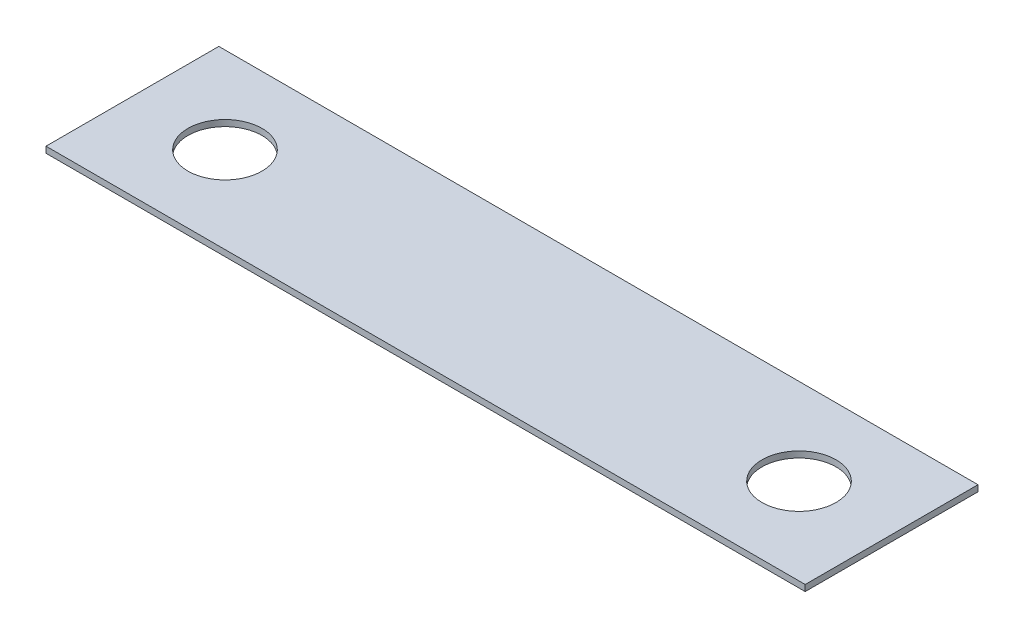
ISO-10303-21;
HEADER;
FILE_DESCRIPTION(('STEP AP214'),'2;1');
FILE_NAME('part.step','',(''),(''),'','','');
FILE_SCHEMA(('AUTOMOTIVE_DESIGN { 1 0 10303 214 1 1 1 1 }'));
ENDSEC;
DATA;
#1=APPLICATION_CONTEXT('core data for automotive mechanical design processes');
#2=APPLICATION_PROTOCOL_DEFINITION('international standard','automotive_design',2000,#1);
#3=PRODUCT_CONTEXT('',#1,'mechanical');
#4=PRODUCT('Part','Part','',(#3));
#5=PRODUCT_RELATED_PRODUCT_CATEGORY('part','',(#4));
#6=PRODUCT_DEFINITION_FORMATION('','',#4);
#7=PRODUCT_DEFINITION_CONTEXT('part definition',#1,'design');
#8=PRODUCT_DEFINITION('design','',#6,#7);
#9=PRODUCT_DEFINITION_SHAPE('','',#8);
#10=(LENGTH_UNIT() NAMED_UNIT(*) SI_UNIT(.MILLI.,.METRE.));
#11=(NAMED_UNIT(*) PLANE_ANGLE_UNIT() SI_UNIT($,.RADIAN.));
#12=(NAMED_UNIT(*) SI_UNIT($,.STERADIAN.) SOLID_ANGLE_UNIT());
#13=UNCERTAINTY_MEASURE_WITH_UNIT(LENGTH_MEASURE(1.E-05),#10,'distance_accuracy_value','');
#14=(GEOMETRIC_REPRESENTATION_CONTEXT(3) GLOBAL_UNCERTAINTY_ASSIGNED_CONTEXT((#13)) GLOBAL_UNIT_ASSIGNED_CONTEXT((#10,
#11,#12)) REPRESENTATION_CONTEXT('',''));
#15=CARTESIAN_POINT('',(0.,0.,0.));
#16=DIRECTION('',(0.,0.,1.));
#17=DIRECTION('',(1.,0.,0.));
#18=AXIS2_PLACEMENT_3D('',#15,#16,#17);
#19=CARTESIAN_POINT('',(-61.5,1.,14.));
#20=DIRECTION('',(1.,0.,0.));
#21=DIRECTION('',(0.,0.,-1.));
#22=AXIS2_PLACEMENT_3D('',#19,#20,#21);
#23=PLANE('',#22);
#24=DIRECTION('',(0.,0.,1.));
#25=VECTOR('',#24,1.);
#26=CARTESIAN_POINT('',(-61.5,0.,14.));
#27=LINE('',#26,#25);
#28=CARTESIAN_POINT('',(-61.5,0.,-14.));
#29=VERTEX_POINT('',#28);
#30=CARTESIAN_POINT('',(-61.5,0.,14.));
#31=VERTEX_POINT('',#30);
#32=EDGE_CURVE('E102',#29,#31,#27,.T.);
#33=ORIENTED_EDGE('',*,*,#32,.T.);
#34=DIRECTION('',(0.,-1.,0.));
#35=VECTOR('',#34,1.);
#36=CARTESIAN_POINT('',(-61.5,1.,14.));
#37=LINE('',#36,#35);
#38=CARTESIAN_POINT('',(-61.5,1.,14.));
#39=VERTEX_POINT('',#38);
#40=EDGE_CURVE('E11',#39,#31,#37,.T.);
#41=ORIENTED_EDGE('',*,*,#40,.F.);
#42=DIRECTION('',(0.,0.,1.));
#43=VECTOR('',#42,1.);
#44=CARTESIAN_POINT('',(-61.5,1.,14.));
#45=LINE('',#44,#43);
#46=CARTESIAN_POINT('',(-61.5,1.,-14.));
#47=VERTEX_POINT('',#46);
#48=EDGE_CURVE('E90',#47,#39,#45,.T.);
#49=ORIENTED_EDGE('',*,*,#48,.F.);
#50=DIRECTION('',(0.,-1.,0.));
#51=VECTOR('',#50,1.);
#52=CARTESIAN_POINT('',(-61.5,1.,-14.));
#53=LINE('',#52,#51);
#54=EDGE_CURVE('E98',#47,#29,#53,.T.);
#55=ORIENTED_EDGE('',*,*,#54,.T.);
#56=EDGE_LOOP('',(#33,#41,#49,#55));
#57=FACE_BOUND('',#56,.T.);
#58=ADVANCED_FACE('F39',(#57),#23,.F.);
#59=CARTESIAN_POINT('',(61.5,1.,14.));
#60=DIRECTION('',(0.,0.,-1.));
#61=DIRECTION('',(-1.,0.,0.));
#62=AXIS2_PLACEMENT_3D('',#59,#60,#61);
#63=PLANE('',#62);
#64=DIRECTION('',(1.,0.,0.));
#65=VECTOR('',#64,1.);
#66=CARTESIAN_POINT('',(61.5,0.,14.));
#67=LINE('',#66,#65);
#68=CARTESIAN_POINT('',(61.5,0.,14.));
#69=VERTEX_POINT('',#68);
#70=EDGE_CURVE('E94',#31,#69,#67,.T.);
#71=ORIENTED_EDGE('',*,*,#70,.T.);
#72=DIRECTION('',(0.,-1.,0.));
#73=VECTOR('',#72,1.);
#74=CARTESIAN_POINT('',(61.5,1.,14.));
#75=LINE('',#74,#73);
#76=CARTESIAN_POINT('',(61.5,1.,14.));
#77=VERTEX_POINT('',#76);
#78=EDGE_CURVE('E47',#77,#69,#75,.T.);
#79=ORIENTED_EDGE('',*,*,#78,.F.);
#80=DIRECTION('',(1.,0.,0.));
#81=VECTOR('',#80,1.);
#82=CARTESIAN_POINT('',(61.5,1.,14.));
#83=LINE('',#82,#81);
#84=EDGE_CURVE('E85',#39,#77,#83,.T.);
#85=ORIENTED_EDGE('',*,*,#84,.F.);
#86=ORIENTED_EDGE('',*,*,#40,.T.);
#87=EDGE_LOOP('',(#71,#79,#85,#86));
#88=FACE_BOUND('',#87,.T.);
#89=ADVANCED_FACE('F93',(#88),#63,.F.);
#90=CARTESIAN_POINT('',(61.5,1.,14.));
#91=DIRECTION('',(-1.,0.,0.));
#92=DIRECTION('',(0.,0.,1.));
#93=AXIS2_PLACEMENT_3D('',#90,#91,#92);
#94=PLANE('',#93);
#95=DIRECTION('',(0.,0.,-1.));
#96=VECTOR('',#95,1.);
#97=CARTESIAN_POINT('',(61.5,0.,14.));
#98=LINE('',#97,#96);
#99=CARTESIAN_POINT('',(61.5,0.,-14.));
#100=VERTEX_POINT('',#99);
#101=EDGE_CURVE('E72',#69,#100,#98,.T.);
#102=ORIENTED_EDGE('',*,*,#101,.T.);
#103=DIRECTION('',(0.,-1.,0.));
#104=VECTOR('',#103,1.);
#105=CARTESIAN_POINT('',(61.5,1.,-14.));
#106=LINE('',#105,#104);
#107=CARTESIAN_POINT('',(61.5,1.,-14.));
#108=VERTEX_POINT('',#107);
#109=EDGE_CURVE('E95',#108,#100,#106,.T.);
#110=ORIENTED_EDGE('',*,*,#109,.F.);
#111=DIRECTION('',(0.,0.,-1.));
#112=VECTOR('',#111,1.);
#113=CARTESIAN_POINT('',(61.5,1.,14.));
#114=LINE('',#113,#112);
#115=EDGE_CURVE('E88',#77,#108,#114,.T.);
#116=ORIENTED_EDGE('',*,*,#115,.F.);
#117=ORIENTED_EDGE('',*,*,#78,.T.);
#118=EDGE_LOOP('',(#102,#110,#116,#117));
#119=FACE_BOUND('',#118,.T.);
#120=ADVANCED_FACE('F96',(#119),#94,.F.);
#121=CARTESIAN_POINT('',(61.5,1.,-14.));
#122=DIRECTION('',(0.,0.,1.));
#123=DIRECTION('',(1.,0.,0.));
#124=AXIS2_PLACEMENT_3D('',#121,#122,#123);
#125=PLANE('',#124);
#126=DIRECTION('',(-1.,0.,0.));
#127=VECTOR('',#126,1.);
#128=CARTESIAN_POINT('',(61.5,0.,-14.));
#129=LINE('',#128,#127);
#130=EDGE_CURVE('E78',#100,#29,#129,.T.);
#131=ORIENTED_EDGE('',*,*,#130,.T.);
#132=ORIENTED_EDGE('',*,*,#54,.F.);
#133=DIRECTION('',(-1.,0.,0.));
#134=VECTOR('',#133,1.);
#135=CARTESIAN_POINT('',(61.5,1.,-14.));
#136=LINE('',#135,#134);
#137=EDGE_CURVE('E55',#108,#47,#136,.T.);
#138=ORIENTED_EDGE('',*,*,#137,.F.);
#139=ORIENTED_EDGE('',*,*,#109,.T.);
#140=EDGE_LOOP('',(#131,#132,#138,#139));
#141=FACE_BOUND('',#140,.T.);
#142=ADVANCED_FACE('F110',(#141),#125,.F.);
#143=CARTESIAN_POINT('',(0.,1.,0.));
#144=DIRECTION('',(0.,1.,0.));
#145=DIRECTION('',(0.,0.,1.));
#146=AXIS2_PLACEMENT_3D('',#143,#144,#145);
#147=PLANE('',#146);
#148=CARTESIAN_POINT('',(46.5,1.,0.));
#149=DIRECTION('',(0.,1.,0.));
#150=DIRECTION('',(0.,0.,1.));
#151=AXIS2_PLACEMENT_3D('',#148,#149,#150);
#152=CIRCLE('',#151,6.);
#153=CARTESIAN_POINT('',(46.5,1.,6.00000000000002));
#154=VERTEX_POINT('',#153);
#155=EDGE_CURVE('E122',#154,#154,#152,.T.);
#156=ORIENTED_EDGE('',*,*,#155,.F.);
#157=EDGE_LOOP('',(#156));
#158=FACE_BOUND('',#157,.T.);
#159=CARTESIAN_POINT('',(-46.5,1.,0.));
#160=DIRECTION('',(0.,1.,0.));
#161=DIRECTION('',(0.,0.,1.));
#162=AXIS2_PLACEMENT_3D('',#159,#160,#161);
#163=CIRCLE('',#162,5.99999999999999);
#164=CARTESIAN_POINT('',(-46.5,1.,5.99999999999999));
#165=VERTEX_POINT('',#164);
#166=EDGE_CURVE('E119',#165,#165,#163,.T.);
#167=ORIENTED_EDGE('',*,*,#166,.F.);
#168=EDGE_LOOP('',(#167));
#169=FACE_BOUND('',#168,.T.);
#170=ORIENTED_EDGE('',*,*,#48,.T.);
#171=ORIENTED_EDGE('',*,*,#84,.T.);
#172=ORIENTED_EDGE('',*,*,#115,.T.);
#173=ORIENTED_EDGE('',*,*,#137,.T.);
#174=EDGE_LOOP('',(#170,#171,#172,#173));
#175=FACE_BOUND('',#174,.T.);
#176=ADVANCED_FACE('F86',(#158,#169,#175),#147,.T.);
#177=CARTESIAN_POINT('',(0.,0.,0.));
#178=DIRECTION('',(0.,1.,0.));
#179=DIRECTION('',(0.,0.,1.));
#180=AXIS2_PLACEMENT_3D('',#177,#178,#179);
#181=PLANE('',#180);
#182=CARTESIAN_POINT('',(46.5,0.,0.));
#183=DIRECTION('',(0.,1.,0.));
#184=DIRECTION('',(0.,0.,1.));
#185=AXIS2_PLACEMENT_3D('',#182,#183,#184);
#186=CIRCLE('',#185,6.);
#187=CARTESIAN_POINT('',(46.5,0.,6.00000000000002));
#188=VERTEX_POINT('',#187);
#189=EDGE_CURVE('E105',#188,#188,#186,.T.);
#190=ORIENTED_EDGE('',*,*,#189,.T.);
#191=EDGE_LOOP('',(#190));
#192=FACE_BOUND('',#191,.T.);
#193=CARTESIAN_POINT('',(-46.5,0.,0.));
#194=DIRECTION('',(0.,1.,0.));
#195=DIRECTION('',(0.,0.,1.));
#196=AXIS2_PLACEMENT_3D('',#193,#194,#195);
#197=CIRCLE('',#196,5.99999999999999);
#198=CARTESIAN_POINT('',(-46.5,0.,5.99999999999999));
#199=VERTEX_POINT('',#198);
#200=EDGE_CURVE('E116',#199,#199,#197,.T.);
#201=ORIENTED_EDGE('',*,*,#200,.T.);
#202=EDGE_LOOP('',(#201));
#203=FACE_BOUND('',#202,.T.);
#204=ORIENTED_EDGE('',*,*,#32,.F.);
#205=ORIENTED_EDGE('',*,*,#130,.F.);
#206=ORIENTED_EDGE('',*,*,#101,.F.);
#207=ORIENTED_EDGE('',*,*,#70,.F.);
#208=EDGE_LOOP('',(#204,#205,#206,#207));
#209=FACE_BOUND('',#208,.T.);
#210=ADVANCED_FACE('F113',(#192,#203,#209),#181,.F.);
#211=CARTESIAN_POINT('',(-46.5,0.,0.));
#212=DIRECTION('',(0.,1.,0.));
#213=DIRECTION('',(0.,0.,1.));
#214=AXIS2_PLACEMENT_3D('',#211,#212,#213);
#215=CYLINDRICAL_SURFACE('',#214,5.99999999999999);
#216=ORIENTED_EDGE('',*,*,#200,.F.);
#217=EDGE_LOOP('',(#216));
#218=FACE_BOUND('',#217,.T.);
#219=ORIENTED_EDGE('',*,*,#166,.T.);
#220=EDGE_LOOP('',(#219));
#221=FACE_BOUND('',#220,.T.);
#222=ADVANCED_FACE('F133',(#218,#221),#215,.F.);
#223=CARTESIAN_POINT('',(46.5,0.,0.));
#224=DIRECTION('',(0.,1.,0.));
#225=DIRECTION('',(0.,0.,1.));
#226=AXIS2_PLACEMENT_3D('',#223,#224,#225);
#227=CYLINDRICAL_SURFACE('',#226,6.);
#228=ORIENTED_EDGE('',*,*,#189,.F.);
#229=EDGE_LOOP('',(#228));
#230=FACE_BOUND('',#229,.T.);
#231=ORIENTED_EDGE('',*,*,#155,.T.);
#232=EDGE_LOOP('',(#231));
#233=FACE_BOUND('',#232,.T.);
#234=ADVANCED_FACE('F130',(#230,#233),#227,.F.);
#235=CLOSED_SHELL('',(#58,#89,#120,#142,#176,#210,#222,#234));
#236=MANIFOLD_SOLID_BREP('B2',#235);
#237=ADVANCED_BREP_SHAPE_REPRESENTATION('',(#18,#236),#14);
#238=SHAPE_DEFINITION_REPRESENTATION(#9,#237);
ENDSEC;
END-ISO-10303-21;
